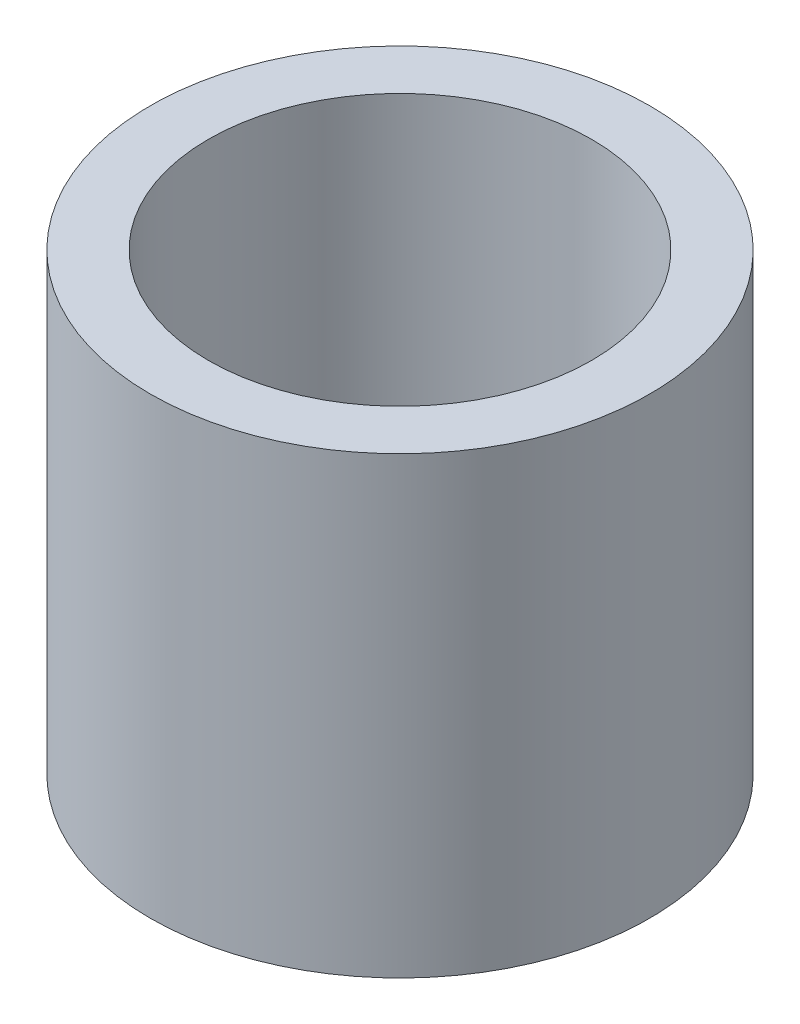
ISO-10303-21;
HEADER;
FILE_DESCRIPTION(('STEP AP214'),'2;1');
FILE_NAME('part.step','',(''),(''),'','','');
FILE_SCHEMA(('AUTOMOTIVE_DESIGN { 1 0 10303 214 1 1 1 1 }'));
ENDSEC;
DATA;
#1=APPLICATION_CONTEXT('core data for automotive mechanical design processes');
#2=APPLICATION_PROTOCOL_DEFINITION('international standard','automotive_design',2000,#1);
#3=PRODUCT_CONTEXT('',#1,'mechanical');
#4=PRODUCT('Part','Part','',(#3));
#5=PRODUCT_RELATED_PRODUCT_CATEGORY('part','',(#4));
#6=PRODUCT_DEFINITION_FORMATION('','',#4);
#7=PRODUCT_DEFINITION_CONTEXT('part definition',#1,'design');
#8=PRODUCT_DEFINITION('design','',#6,#7);
#9=PRODUCT_DEFINITION_SHAPE('','',#8);
#10=(LENGTH_UNIT() NAMED_UNIT(*) SI_UNIT(.MILLI.,.METRE.));
#11=(NAMED_UNIT(*) PLANE_ANGLE_UNIT() SI_UNIT($,.RADIAN.));
#12=(NAMED_UNIT(*) SI_UNIT($,.STERADIAN.) SOLID_ANGLE_UNIT());
#13=UNCERTAINTY_MEASURE_WITH_UNIT(LENGTH_MEASURE(1.E-05),#10,'distance_accuracy_value','');
#14=(GEOMETRIC_REPRESENTATION_CONTEXT(3) GLOBAL_UNCERTAINTY_ASSIGNED_CONTEXT((#13)) GLOBAL_UNIT_ASSIGNED_CONTEXT((#10,
#11,#12)) REPRESENTATION_CONTEXT('',''));
#15=CARTESIAN_POINT('',(0.,0.,0.));
#16=DIRECTION('',(0.,0.,1.));
#17=DIRECTION('',(1.,0.,0.));
#18=AXIS2_PLACEMENT_3D('',#15,#16,#17);
#19=CARTESIAN_POINT('',(17.4625,31.75,0.));
#20=DIRECTION('',(0.,-1.,0.));
#21=DIRECTION('',(0.,0.,-1.));
#22=AXIS2_PLACEMENT_3D('',#19,#20,#21);
#23=PLANE('',#22);
#24=CARTESIAN_POINT('',(0.,31.75,0.));
#25=DIRECTION('',(0.,1.,0.));
#26=DIRECTION('',(0.,0.,1.));
#27=AXIS2_PLACEMENT_3D('',#24,#25,#26);
#28=CIRCLE('',#27,13.3985);
#29=CARTESIAN_POINT('',(0.,31.75,13.3985));
#30=VERTEX_POINT('',#29);
#31=EDGE_CURVE('E10',#30,#30,#28,.T.);
#32=ORIENTED_EDGE('',*,*,#31,.F.);
#33=EDGE_LOOP('',(#32));
#34=FACE_BOUND('',#33,.T.);
#35=CARTESIAN_POINT('',(0.,31.75,0.));
#36=DIRECTION('',(0.,1.,0.));
#37=DIRECTION('',(0.,0.,1.));
#38=AXIS2_PLACEMENT_3D('',#35,#36,#37);
#39=CIRCLE('',#38,17.4625);
#40=CARTESIAN_POINT('',(0.,31.75,17.4625));
#41=VERTEX_POINT('',#40);
#42=EDGE_CURVE('E45',#41,#41,#39,.T.);
#43=ORIENTED_EDGE('',*,*,#42,.T.);
#44=EDGE_LOOP('',(#43));
#45=FACE_BOUND('',#44,.T.);
#46=ADVANCED_FACE('F31',(#34,#45),#23,.F.);
#47=CARTESIAN_POINT('',(0.,4.31799999999999,0.));
#48=DIRECTION('',(0.,1.,0.));
#49=DIRECTION('',(0.,0.,1.));
#50=AXIS2_PLACEMENT_3D('',#47,#48,#49);
#51=CYLINDRICAL_SURFACE('',#50,13.3985);
#52=CARTESIAN_POINT('',(0.,4.318,0.));
#53=DIRECTION('',(0.,1.,0.));
#54=DIRECTION('',(0.,0.,1.));
#55=AXIS2_PLACEMENT_3D('',#52,#53,#54);
#56=CIRCLE('',#55,13.3985);
#57=CARTESIAN_POINT('',(0.,4.318,13.3985));
#58=VERTEX_POINT('',#57);
#59=EDGE_CURVE('E37',#58,#58,#56,.T.);
#60=ORIENTED_EDGE('',*,*,#59,.F.);
#61=EDGE_LOOP('',(#60));
#62=FACE_BOUND('',#61,.T.);
#63=ORIENTED_EDGE('',*,*,#31,.T.);
#64=EDGE_LOOP('',(#63));
#65=FACE_BOUND('',#64,.T.);
#66=ADVANCED_FACE('F77',(#62,#65),#51,.F.);
#67=CARTESIAN_POINT('',(13.3985,4.31799999999999,0.));
#68=DIRECTION('',(0.,-1.,0.));
#69=DIRECTION('',(0.,0.,-1.));
#70=AXIS2_PLACEMENT_3D('',#67,#68,#69);
#71=PLANE('',#70);
#72=CARTESIAN_POINT('',(0.,4.31799999999999,0.));
#73=DIRECTION('',(0.,-1.,0.));
#74=DIRECTION('',(0.,0.,-1.));
#75=AXIS2_PLACEMENT_3D('',#72,#73,#74);
#76=CIRCLE('',#75,1.89864999999999);
#77=CARTESIAN_POINT('',(0.,4.31799999999999,-1.89864999999999));
#78=VERTEX_POINT('',#77);
#79=EDGE_CURVE('E50',#78,#78,#76,.T.);
#80=ORIENTED_EDGE('',*,*,#79,.T.);
#81=EDGE_LOOP('',(#80));
#82=FACE_BOUND('',#81,.T.);
#83=ORIENTED_EDGE('',*,*,#59,.T.);
#84=EDGE_LOOP('',(#83));
#85=FACE_BOUND('',#84,.T.);
#86=ADVANCED_FACE('F64',(#82,#85),#71,.F.);
#87=CARTESIAN_POINT('',(0.,0.,0.));
#88=DIRECTION('',(0.,1.,0.));
#89=DIRECTION('',(0.,0.,1.));
#90=AXIS2_PLACEMENT_3D('',#87,#88,#89);
#91=PLANE('',#90);
#92=CARTESIAN_POINT('',(0.,0.,0.));
#93=DIRECTION('',(0.,-1.,0.));
#94=DIRECTION('',(0.,0.,-1.));
#95=AXIS2_PLACEMENT_3D('',#92,#93,#94);
#96=CIRCLE('',#95,1.89864999999999);
#97=CARTESIAN_POINT('',(0.,0.,-1.89864999999999));
#98=VERTEX_POINT('',#97);
#99=EDGE_CURVE('E53',#98,#98,#96,.T.);
#100=ORIENTED_EDGE('',*,*,#99,.F.);
#101=EDGE_LOOP('',(#100));
#102=FACE_BOUND('',#101,.T.);
#103=CARTESIAN_POINT('',(0.,0.,0.));
#104=DIRECTION('',(0.,1.,0.));
#105=DIRECTION('',(0.,0.,1.));
#106=AXIS2_PLACEMENT_3D('',#103,#104,#105);
#107=CIRCLE('',#106,17.4625);
#108=CARTESIAN_POINT('',(0.,0.,17.4625));
#109=VERTEX_POINT('',#108);
#110=EDGE_CURVE('E41',#109,#109,#107,.T.);
#111=ORIENTED_EDGE('',*,*,#110,.F.);
#112=EDGE_LOOP('',(#111));
#113=FACE_BOUND('',#112,.T.);
#114=ADVANCED_FACE('F60',(#102,#113),#91,.F.);
#115=CARTESIAN_POINT('',(0.,4.31799999999999,0.));
#116=DIRECTION('',(0.,1.,0.));
#117=DIRECTION('',(0.,0.,1.));
#118=AXIS2_PLACEMENT_3D('',#115,#116,#117);
#119=CYLINDRICAL_SURFACE('',#118,17.4625);
#120=ORIENTED_EDGE('',*,*,#42,.F.);
#121=EDGE_LOOP('',(#120));
#122=FACE_BOUND('',#121,.T.);
#123=ORIENTED_EDGE('',*,*,#110,.T.);
#124=EDGE_LOOP('',(#123));
#125=FACE_BOUND('',#124,.T.);
#126=ADVANCED_FACE('F63',(#122,#125),#119,.T.);
#127=CARTESIAN_POINT('',(0.,0.,0.));
#128=DIRECTION('',(0.,-1.,0.));
#129=DIRECTION('',(0.,0.,-1.));
#130=AXIS2_PLACEMENT_3D('',#127,#128,#129);
#131=CYLINDRICAL_SURFACE('',#130,1.89864999999999);
#132=ORIENTED_EDGE('',*,*,#99,.T.);
#133=EDGE_LOOP('',(#132));
#134=FACE_BOUND('',#133,.T.);
#135=ORIENTED_EDGE('',*,*,#79,.F.);
#136=EDGE_LOOP('',(#135));
#137=FACE_BOUND('',#136,.T.);
#138=ADVANCED_FACE('F57',(#134,#137),#131,.F.);
#139=CLOSED_SHELL('',(#46,#66,#86,#114,#126,#138));
#140=MANIFOLD_SOLID_BREP('B2',#139);
#141=ADVANCED_BREP_SHAPE_REPRESENTATION('',(#18,#140),#14);
#142=SHAPE_DEFINITION_REPRESENTATION(#9,#141);
ENDSEC;
END-ISO-10303-21;
